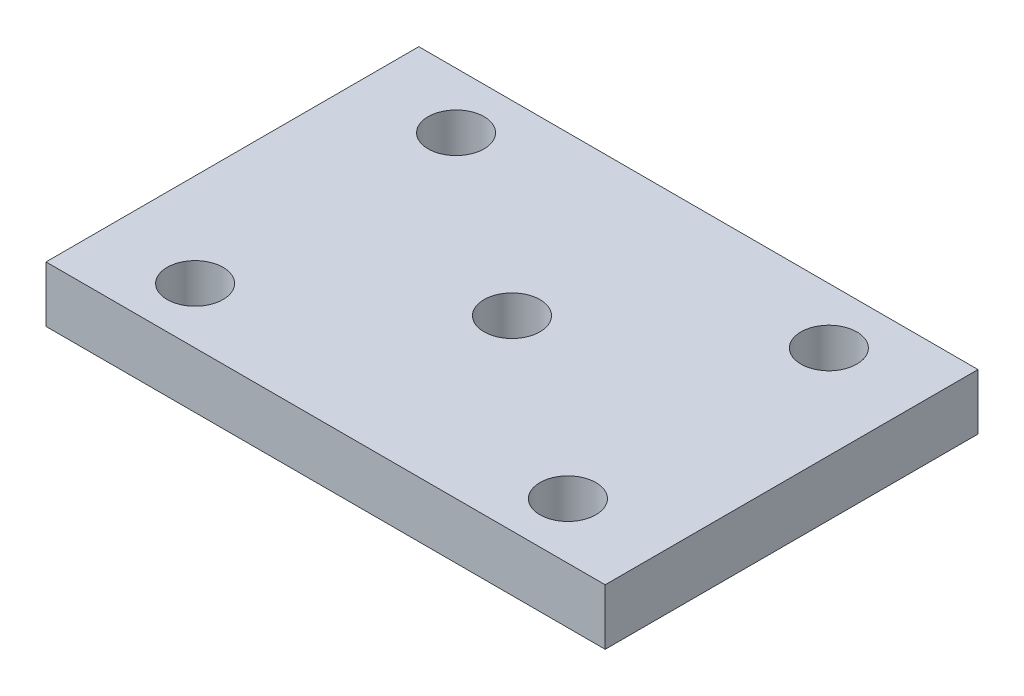
ISO-10303-21;
HEADER;
FILE_DESCRIPTION(('STEP AP214'),'2;1');
FILE_NAME('part.step','',(''),(''),'','','');
FILE_SCHEMA(('AUTOMOTIVE_DESIGN { 1 0 10303 214 1 1 1 1 }'));
ENDSEC;
DATA;
#1=APPLICATION_CONTEXT('core data for automotive mechanical design processes');
#2=APPLICATION_PROTOCOL_DEFINITION('international standard','automotive_design',2000,#1);
#3=PRODUCT_CONTEXT('',#1,'mechanical');
#4=PRODUCT('Part','Part','',(#3));
#5=PRODUCT_RELATED_PRODUCT_CATEGORY('part','',(#4));
#6=PRODUCT_DEFINITION_FORMATION('','',#4);
#7=PRODUCT_DEFINITION_CONTEXT('part definition',#1,'design');
#8=PRODUCT_DEFINITION('design','',#6,#7);
#9=PRODUCT_DEFINITION_SHAPE('','',#8);
#10=(LENGTH_UNIT() NAMED_UNIT(*) SI_UNIT(.MILLI.,.METRE.));
#11=(NAMED_UNIT(*) PLANE_ANGLE_UNIT() SI_UNIT($,.RADIAN.));
#12=(NAMED_UNIT(*) SI_UNIT($,.STERADIAN.) SOLID_ANGLE_UNIT());
#13=UNCERTAINTY_MEASURE_WITH_UNIT(LENGTH_MEASURE(1.E-05),#10,'distance_accuracy_value','');
#14=(GEOMETRIC_REPRESENTATION_CONTEXT(3) GLOBAL_UNCERTAINTY_ASSIGNED_CONTEXT((#13)) GLOBAL_UNIT_ASSIGNED_CONTEXT((#10,
#11,#12)) REPRESENTATION_CONTEXT('',''));
#15=CARTESIAN_POINT('',(0.,0.,0.));
#16=DIRECTION('',(0.,0.,1.));
#17=DIRECTION('',(1.,0.,0.));
#18=AXIS2_PLACEMENT_3D('',#15,#16,#17);
#19=CARTESIAN_POINT('',(0.,3.,0.));
#20=DIRECTION('',(0.,1.,0.));
#21=DIRECTION('',(0.,0.,1.));
#22=AXIS2_PLACEMENT_3D('',#19,#20,#21);
#23=PLANE('',#22);
#24=CARTESIAN_POINT('',(-10.,3.,-7.));
#25=DIRECTION('',(0.,1.,0.));
#26=DIRECTION('',(0.,0.,-1.));
#27=AXIS2_PLACEMENT_3D('',#24,#25,#26);
#28=CIRCLE('',#27,1.5);
#29=CARTESIAN_POINT('',(-10.,3.,-8.5));
#30=VERTEX_POINT('',#29);
#31=EDGE_CURVE('E131',#30,#30,#28,.T.);
#32=ORIENTED_EDGE('',*,*,#31,.F.);
#33=EDGE_LOOP('',(#32));
#34=FACE_BOUND('',#33,.T.);
#35=CARTESIAN_POINT('',(10.,3.,7.));
#36=DIRECTION('',(0.,1.,0.));
#37=DIRECTION('',(0.,0.,-1.));
#38=AXIS2_PLACEMENT_3D('',#35,#36,#37);
#39=CIRCLE('',#38,1.5);
#40=CARTESIAN_POINT('',(10.,3.,5.5));
#41=VERTEX_POINT('',#40);
#42=EDGE_CURVE('E119',#41,#41,#39,.T.);
#43=ORIENTED_EDGE('',*,*,#42,.F.);
#44=EDGE_LOOP('',(#43));
#45=FACE_BOUND('',#44,.T.);
#46=DIRECTION('',(0.,0.,1.));
#47=VECTOR('',#46,1.);
#48=CARTESIAN_POINT('',(-15.,3.,-10.));
#49=LINE('',#48,#47);
#50=CARTESIAN_POINT('',(-15.,3.,-10.));
#51=VERTEX_POINT('',#50);
#52=CARTESIAN_POINT('',(-15.,3.,10.));
#53=VERTEX_POINT('',#52);
#54=EDGE_CURVE('E89',#51,#53,#49,.T.);
#55=ORIENTED_EDGE('',*,*,#54,.T.);
#56=DIRECTION('',(1.,0.,0.));
#57=VECTOR('',#56,1.);
#58=CARTESIAN_POINT('',(-15.,3.,10.));
#59=LINE('',#58,#57);
#60=CARTESIAN_POINT('',(15.,3.,10.));
#61=VERTEX_POINT('',#60);
#62=EDGE_CURVE('E84',#53,#61,#59,.T.);
#63=ORIENTED_EDGE('',*,*,#62,.T.);
#64=DIRECTION('',(0.,0.,-1.));
#65=VECTOR('',#64,1.);
#66=CARTESIAN_POINT('',(15.,3.,-10.));
#67=LINE('',#66,#65);
#68=CARTESIAN_POINT('',(15.,3.,-10.));
#69=VERTEX_POINT('',#68);
#70=EDGE_CURVE('E87',#61,#69,#67,.T.);
#71=ORIENTED_EDGE('',*,*,#70,.T.);
#72=DIRECTION('',(-1.,0.,0.));
#73=VECTOR('',#72,1.);
#74=CARTESIAN_POINT('',(-15.,3.,-10.));
#75=LINE('',#74,#73);
#76=EDGE_CURVE('E54',#69,#51,#75,.T.);
#77=ORIENTED_EDGE('',*,*,#76,.T.);
#78=EDGE_LOOP('',(#55,#63,#71,#77));
#79=FACE_BOUND('',#78,.T.);
#80=CARTESIAN_POINT('',(-10.,3.,7.));
#81=DIRECTION('',(0.,1.,0.));
#82=DIRECTION('',(0.,0.,1.));
#83=AXIS2_PLACEMENT_3D('',#80,#81,#82);
#84=CIRCLE('',#83,1.5);
#85=CARTESIAN_POINT('',(-10.,3.,8.5));
#86=VERTEX_POINT('',#85);
#87=EDGE_CURVE('E104',#86,#86,#84,.T.);
#88=ORIENTED_EDGE('',*,*,#87,.F.);
#89=EDGE_LOOP('',(#88));
#90=FACE_BOUND('',#89,.T.);
#91=CARTESIAN_POINT('',(10.,3.,-7.));
#92=DIRECTION('',(0.,1.,0.));
#93=DIRECTION('',(0.,0.,1.));
#94=AXIS2_PLACEMENT_3D('',#91,#92,#93);
#95=CIRCLE('',#94,1.5);
#96=CARTESIAN_POINT('',(10.,3.,-5.5));
#97=VERTEX_POINT('',#96);
#98=EDGE_CURVE('E125',#97,#97,#95,.T.);
#99=ORIENTED_EDGE('',*,*,#98,.F.);
#100=EDGE_LOOP('',(#99));
#101=FACE_BOUND('',#100,.T.);
#102=CARTESIAN_POINT('',(0.,3.,0.));
#103=DIRECTION('',(0.,1.,0.));
#104=DIRECTION('',(0.,0.,1.));
#105=AXIS2_PLACEMENT_3D('',#102,#103,#104);
#106=CIRCLE('',#105,1.5);
#107=CARTESIAN_POINT('',(0.,3.,1.5));
#108=VERTEX_POINT('',#107);
#109=EDGE_CURVE('E137',#108,#108,#106,.T.);
#110=ORIENTED_EDGE('',*,*,#109,.F.);
#111=EDGE_LOOP('',(#110));
#112=FACE_BOUND('',#111,.T.);
#113=ADVANCED_FACE('F37',(#34,#45,#79,#90,#101,#112),#23,.T.);
#114=CARTESIAN_POINT('',(0.,0.,0.));
#115=DIRECTION('',(0.,1.,0.));
#116=DIRECTION('',(0.,0.,1.));
#117=AXIS2_PLACEMENT_3D('',#114,#115,#116);
#118=PLANE('',#117);
#119=DIRECTION('',(0.,0.,1.));
#120=VECTOR('',#119,1.);
#121=CARTESIAN_POINT('',(-15.,0.,-10.));
#122=LINE('',#121,#120);
#123=CARTESIAN_POINT('',(-15.,0.,-10.));
#124=VERTEX_POINT('',#123);
#125=CARTESIAN_POINT('',(-15.,0.,10.));
#126=VERTEX_POINT('',#125);
#127=EDGE_CURVE('E101',#124,#126,#122,.T.);
#128=ORIENTED_EDGE('',*,*,#127,.F.);
#129=DIRECTION('',(-1.,0.,0.));
#130=VECTOR('',#129,1.);
#131=CARTESIAN_POINT('',(-15.,0.,-10.));
#132=LINE('',#131,#130);
#133=CARTESIAN_POINT('',(15.,0.,-10.));
#134=VERTEX_POINT('',#133);
#135=EDGE_CURVE('E77',#134,#124,#132,.T.);
#136=ORIENTED_EDGE('',*,*,#135,.F.);
#137=DIRECTION('',(0.,0.,-1.));
#138=VECTOR('',#137,1.);
#139=CARTESIAN_POINT('',(15.,0.,-10.));
#140=LINE('',#139,#138);
#141=CARTESIAN_POINT('',(15.,0.,10.));
#142=VERTEX_POINT('',#141);
#143=EDGE_CURVE('E71',#142,#134,#140,.T.);
#144=ORIENTED_EDGE('',*,*,#143,.F.);
#145=DIRECTION('',(1.,0.,0.));
#146=VECTOR('',#145,1.);
#147=CARTESIAN_POINT('',(-15.,0.,10.));
#148=LINE('',#147,#146);
#149=EDGE_CURVE('E93',#126,#142,#148,.T.);
#150=ORIENTED_EDGE('',*,*,#149,.F.);
#151=EDGE_LOOP('',(#128,#136,#144,#150));
#152=FACE_BOUND('',#151,.T.);
#153=CARTESIAN_POINT('',(-10.,0.,7.));
#154=DIRECTION('',(0.,1.,0.));
#155=DIRECTION('',(0.,0.,1.));
#156=AXIS2_PLACEMENT_3D('',#153,#154,#155);
#157=CIRCLE('',#156,1.5);
#158=CARTESIAN_POINT('',(-10.,0.,8.5));
#159=VERTEX_POINT('',#158);
#160=EDGE_CURVE('E116',#159,#159,#157,.T.);
#161=ORIENTED_EDGE('',*,*,#160,.T.);
#162=EDGE_LOOP('',(#161));
#163=FACE_BOUND('',#162,.T.);
#164=CARTESIAN_POINT('',(10.,0.,7.));
#165=DIRECTION('',(0.,1.,0.));
#166=DIRECTION('',(0.,0.,-1.));
#167=AXIS2_PLACEMENT_3D('',#164,#165,#166);
#168=CIRCLE('',#167,1.5);
#169=CARTESIAN_POINT('',(10.,0.,5.5));
#170=VERTEX_POINT('',#169);
#171=EDGE_CURVE('E122',#170,#170,#168,.T.);
#172=ORIENTED_EDGE('',*,*,#171,.T.);
#173=EDGE_LOOP('',(#172));
#174=FACE_BOUND('',#173,.T.);
#175=CARTESIAN_POINT('',(10.,0.,-7.));
#176=DIRECTION('',(0.,1.,0.));
#177=DIRECTION('',(0.,0.,1.));
#178=AXIS2_PLACEMENT_3D('',#175,#176,#177);
#179=CIRCLE('',#178,1.5);
#180=CARTESIAN_POINT('',(10.,0.,-5.5));
#181=VERTEX_POINT('',#180);
#182=EDGE_CURVE('E128',#181,#181,#179,.T.);
#183=ORIENTED_EDGE('',*,*,#182,.T.);
#184=EDGE_LOOP('',(#183));
#185=FACE_BOUND('',#184,.T.);
#186=CARTESIAN_POINT('',(-10.,0.,-7.));
#187=DIRECTION('',(0.,1.,0.));
#188=DIRECTION('',(0.,0.,-1.));
#189=AXIS2_PLACEMENT_3D('',#186,#187,#188);
#190=CIRCLE('',#189,1.5);
#191=CARTESIAN_POINT('',(-10.,0.,-8.5));
#192=VERTEX_POINT('',#191);
#193=EDGE_CURVE('E134',#192,#192,#190,.T.);
#194=ORIENTED_EDGE('',*,*,#193,.T.);
#195=EDGE_LOOP('',(#194));
#196=FACE_BOUND('',#195,.T.);
#197=CARTESIAN_POINT('',(0.,0.,0.));
#198=DIRECTION('',(0.,1.,0.));
#199=DIRECTION('',(0.,0.,1.));
#200=AXIS2_PLACEMENT_3D('',#197,#198,#199);
#201=CIRCLE('',#200,1.5);
#202=CARTESIAN_POINT('',(0.,0.,1.5));
#203=VERTEX_POINT('',#202);
#204=EDGE_CURVE('E140',#203,#203,#201,.T.);
#205=ORIENTED_EDGE('',*,*,#204,.T.);
#206=EDGE_LOOP('',(#205));
#207=FACE_BOUND('',#206,.T.);
#208=ADVANCED_FACE('F112',(#152,#163,#174,#185,#196,#207),#118,.F.);
#209=CARTESIAN_POINT('',(-15.,3.,-10.));
#210=DIRECTION('',(1.,0.,0.));
#211=DIRECTION('',(0.,0.,-1.));
#212=AXIS2_PLACEMENT_3D('',#209,#210,#211);
#213=PLANE('',#212);
#214=ORIENTED_EDGE('',*,*,#127,.T.);
#215=DIRECTION('',(0.,-1.,0.));
#216=VECTOR('',#215,1.);
#217=CARTESIAN_POINT('',(-15.,3.,10.));
#218=LINE('',#217,#216);
#219=EDGE_CURVE('E11',#53,#126,#218,.T.);
#220=ORIENTED_EDGE('',*,*,#219,.F.);
#221=ORIENTED_EDGE('',*,*,#54,.F.);
#222=DIRECTION('',(0.,-1.,0.));
#223=VECTOR('',#222,1.);
#224=CARTESIAN_POINT('',(-15.,3.,-10.));
#225=LINE('',#224,#223);
#226=EDGE_CURVE('E97',#51,#124,#225,.T.);
#227=ORIENTED_EDGE('',*,*,#226,.T.);
#228=EDGE_LOOP('',(#214,#220,#221,#227));
#229=FACE_BOUND('',#228,.T.);
#230=ADVANCED_FACE('F39',(#229),#213,.F.);
#231=CARTESIAN_POINT('',(-15.,3.,10.));
#232=DIRECTION('',(0.,0.,-1.));
#233=DIRECTION('',(-1.,0.,0.));
#234=AXIS2_PLACEMENT_3D('',#231,#232,#233);
#235=PLANE('',#234);
#236=ORIENTED_EDGE('',*,*,#149,.T.);
#237=DIRECTION('',(0.,-1.,0.));
#238=VECTOR('',#237,1.);
#239=CARTESIAN_POINT('',(15.,3.,10.));
#240=LINE('',#239,#238);
#241=EDGE_CURVE('E46',#61,#142,#240,.T.);
#242=ORIENTED_EDGE('',*,*,#241,.F.);
#243=ORIENTED_EDGE('',*,*,#62,.F.);
#244=ORIENTED_EDGE('',*,*,#219,.T.);
#245=EDGE_LOOP('',(#236,#242,#243,#244));
#246=FACE_BOUND('',#245,.T.);
#247=ADVANCED_FACE('F92',(#246),#235,.F.);
#248=CARTESIAN_POINT('',(15.,3.,-10.));
#249=DIRECTION('',(-1.,0.,0.));
#250=DIRECTION('',(0.,0.,1.));
#251=AXIS2_PLACEMENT_3D('',#248,#249,#250);
#252=PLANE('',#251);
#253=ORIENTED_EDGE('',*,*,#143,.T.);
#254=DIRECTION('',(0.,-1.,0.));
#255=VECTOR('',#254,1.);
#256=CARTESIAN_POINT('',(15.,3.,-10.));
#257=LINE('',#256,#255);
#258=EDGE_CURVE('E94',#69,#134,#257,.T.);
#259=ORIENTED_EDGE('',*,*,#258,.F.);
#260=ORIENTED_EDGE('',*,*,#70,.F.);
#261=ORIENTED_EDGE('',*,*,#241,.T.);
#262=EDGE_LOOP('',(#253,#259,#260,#261));
#263=FACE_BOUND('',#262,.T.);
#264=ADVANCED_FACE('F95',(#263),#252,.F.);
#265=CARTESIAN_POINT('',(-15.,3.,-10.));
#266=DIRECTION('',(0.,0.,1.));
#267=DIRECTION('',(1.,0.,0.));
#268=AXIS2_PLACEMENT_3D('',#265,#266,#267);
#269=PLANE('',#268);
#270=ORIENTED_EDGE('',*,*,#135,.T.);
#271=ORIENTED_EDGE('',*,*,#226,.F.);
#272=ORIENTED_EDGE('',*,*,#76,.F.);
#273=ORIENTED_EDGE('',*,*,#258,.T.);
#274=EDGE_LOOP('',(#270,#271,#272,#273));
#275=FACE_BOUND('',#274,.T.);
#276=ADVANCED_FACE('F109',(#275),#269,.F.);
#277=CARTESIAN_POINT('',(-10.,3.,7.));
#278=DIRECTION('',(0.,-1.,0.));
#279=DIRECTION('',(0.,0.,-1.));
#280=AXIS2_PLACEMENT_3D('',#277,#278,#279);
#281=CYLINDRICAL_SURFACE('',#280,1.5);
#282=ORIENTED_EDGE('',*,*,#87,.T.);
#283=EDGE_LOOP('',(#282));
#284=FACE_BOUND('',#283,.T.);
#285=ORIENTED_EDGE('',*,*,#160,.F.);
#286=EDGE_LOOP('',(#285));
#287=FACE_BOUND('',#286,.T.);
#288=ADVANCED_FACE('F159',(#284,#287),#281,.F.);
#289=CARTESIAN_POINT('',(10.,3.,7.));
#290=DIRECTION('',(0.,-1.,0.));
#291=DIRECTION('',(0.,0.,-1.));
#292=AXIS2_PLACEMENT_3D('',#289,#290,#291);
#293=CYLINDRICAL_SURFACE('',#292,1.5);
#294=ORIENTED_EDGE('',*,*,#42,.T.);
#295=EDGE_LOOP('',(#294));
#296=FACE_BOUND('',#295,.T.);
#297=ORIENTED_EDGE('',*,*,#171,.F.);
#298=EDGE_LOOP('',(#297));
#299=FACE_BOUND('',#298,.T.);
#300=ADVANCED_FACE('F205',(#296,#299),#293,.F.);
#301=CARTESIAN_POINT('',(10.,3.,-7.));
#302=DIRECTION('',(0.,-1.,0.));
#303=DIRECTION('',(0.,0.,-1.));
#304=AXIS2_PLACEMENT_3D('',#301,#302,#303);
#305=CYLINDRICAL_SURFACE('',#304,1.5);
#306=ORIENTED_EDGE('',*,*,#98,.T.);
#307=EDGE_LOOP('',(#306));
#308=FACE_BOUND('',#307,.T.);
#309=ORIENTED_EDGE('',*,*,#182,.F.);
#310=EDGE_LOOP('',(#309));
#311=FACE_BOUND('',#310,.T.);
#312=ADVANCED_FACE('F213',(#308,#311),#305,.F.);
#313=CARTESIAN_POINT('',(-10.,3.,-7.));
#314=DIRECTION('',(0.,-1.,0.));
#315=DIRECTION('',(0.,0.,-1.));
#316=AXIS2_PLACEMENT_3D('',#313,#314,#315);
#317=CYLINDRICAL_SURFACE('',#316,1.5);
#318=ORIENTED_EDGE('',*,*,#31,.T.);
#319=EDGE_LOOP('',(#318));
#320=FACE_BOUND('',#319,.T.);
#321=ORIENTED_EDGE('',*,*,#193,.F.);
#322=EDGE_LOOP('',(#321));
#323=FACE_BOUND('',#322,.T.);
#324=ADVANCED_FACE('F221',(#320,#323),#317,.F.);
#325=CARTESIAN_POINT('',(0.,3.,0.));
#326=DIRECTION('',(0.,-1.,0.));
#327=DIRECTION('',(0.,0.,-1.));
#328=AXIS2_PLACEMENT_3D('',#325,#326,#327);
#329=CYLINDRICAL_SURFACE('',#328,1.5);
#330=ORIENTED_EDGE('',*,*,#109,.T.);
#331=EDGE_LOOP('',(#330));
#332=FACE_BOUND('',#331,.T.);
#333=ORIENTED_EDGE('',*,*,#204,.F.);
#334=EDGE_LOOP('',(#333));
#335=FACE_BOUND('',#334,.T.);
#336=ADVANCED_FACE('F146',(#332,#335),#329,.F.);
#337=CLOSED_SHELL('',(#113,#208,#230,#247,#264,#276,#288,#300,#312,#324,#336));
#338=MANIFOLD_SOLID_BREP('B2',#337);
#339=ADVANCED_BREP_SHAPE_REPRESENTATION('',(#18,#338),#14);
#340=SHAPE_DEFINITION_REPRESENTATION(#9,#339);
ENDSEC;
END-ISO-10303-21;
